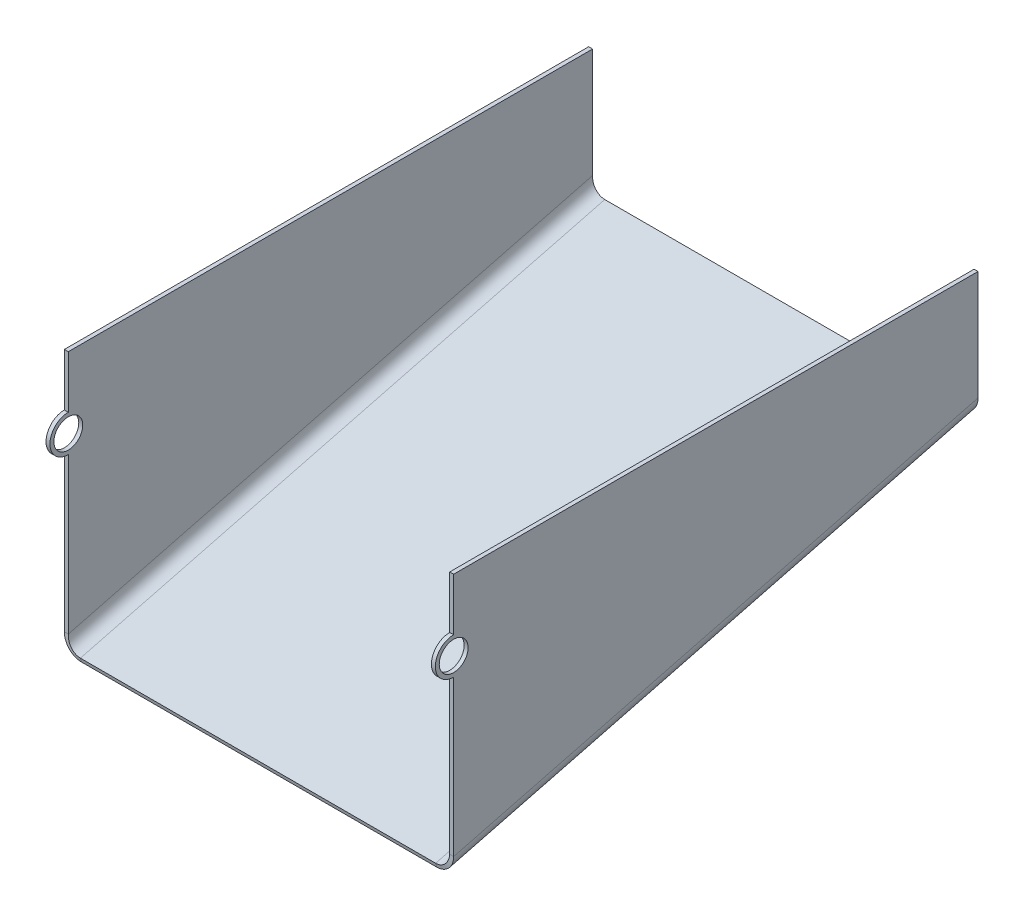
ISO-10303-21;
HEADER;
FILE_DESCRIPTION(('STEP AP214'),'2;1');
FILE_NAME('part.step','',(''),(''),'','','');
FILE_SCHEMA(('AUTOMOTIVE_DESIGN { 1 0 10303 214 1 1 1 1 }'));
ENDSEC;
DATA;
#1=APPLICATION_CONTEXT('core data for automotive mechanical design processes');
#2=APPLICATION_PROTOCOL_DEFINITION('international standard','automotive_design',2000,#1);
#3=PRODUCT_CONTEXT('',#1,'mechanical');
#4=PRODUCT('Part','Part','',(#3));
#5=PRODUCT_RELATED_PRODUCT_CATEGORY('part','',(#4));
#6=PRODUCT_DEFINITION_FORMATION('','',#4);
#7=PRODUCT_DEFINITION_CONTEXT('part definition',#1,'design');
#8=PRODUCT_DEFINITION('design','',#6,#7);
#9=PRODUCT_DEFINITION_SHAPE('','',#8);
#10=(LENGTH_UNIT() NAMED_UNIT(*) SI_UNIT(.MILLI.,.METRE.));
#11=(NAMED_UNIT(*) PLANE_ANGLE_UNIT() SI_UNIT($,.RADIAN.));
#12=(NAMED_UNIT(*) SI_UNIT($,.STERADIAN.) SOLID_ANGLE_UNIT());
#13=UNCERTAINTY_MEASURE_WITH_UNIT(LENGTH_MEASURE(1.E-05),#10,'distance_accuracy_value','');
#14=(GEOMETRIC_REPRESENTATION_CONTEXT(3) GLOBAL_UNCERTAINTY_ASSIGNED_CONTEXT((#13)) GLOBAL_UNIT_ASSIGNED_CONTEXT((#10,
#11,#12)) REPRESENTATION_CONTEXT('',''));
#15=CARTESIAN_POINT('',(0.,0.,0.));
#16=DIRECTION('',(0.,0.,1.));
#17=DIRECTION('',(1.,0.,0.));
#18=AXIS2_PLACEMENT_3D('',#15,#16,#17);
#19=CARTESIAN_POINT('',(297.,51.6415732812399,-366.391066181165));
#20=DIRECTION('',(0.,0.249365435592906,-0.968409458613225));
#21=DIRECTION('',(-1.,0.,0.));
#22=AXIS2_PLACEMENT_3D('',#19,#20,#21);
#23=PLANE('',#22);
#24=DIRECTION('',(0.,-0.968409458613225,-0.249365435592906));
#25=VECTOR('',#24,1.);
#26=CARTESIAN_POINT('',(13.,51.6415732812399,-366.391066181165));
#27=LINE('',#26,#25);
#28=CARTESIAN_POINT('',(13.,54.5468016570796,-365.642969874386));
#29=VERTEX_POINT('',#28);
#30=CARTESIAN_POINT('',(13.,51.6415732812399,-366.391066181165));
#31=VERTEX_POINT('',#30);
#32=EDGE_CURVE('E11',#29,#31,#27,.T.);
#33=ORIENTED_EDGE('',*,*,#32,.F.);
#34=DIRECTION('',(1.,0.,0.));
#35=VECTOR('',#34,1.);
#36=CARTESIAN_POINT('',(297.,54.5468016570796,-365.642969874386));
#37=LINE('',#36,#35);
#38=CARTESIAN_POINT('',(284.,54.5468016570796,-365.642969874386));
#39=VERTEX_POINT('',#38);
#40=EDGE_CURVE('E112',#39,#29,#37,.F.);
#41=ORIENTED_EDGE('',*,*,#40,.F.);
#42=DIRECTION('',(0.,-0.968409458613226,-0.249365435592905));
#43=VECTOR('',#42,1.);
#44=CARTESIAN_POINT('',(284.,51.6415732812399,-366.391066181165));
#45=LINE('',#44,#43);
#46=CARTESIAN_POINT('',(284.,51.6415732812399,-366.391066181165));
#47=VERTEX_POINT('',#46);
#48=EDGE_CURVE('E53',#39,#47,#45,.T.);
#49=ORIENTED_EDGE('',*,*,#48,.T.);
#50=DIRECTION('',(-1.,0.,0.));
#51=VECTOR('',#50,1.);
#52=CARTESIAN_POINT('',(297.,51.6415732812399,-366.391066181165));
#53=LINE('',#52,#51);
#54=EDGE_CURVE('E114',#47,#31,#53,.T.);
#55=ORIENTED_EDGE('',*,*,#54,.T.);
#56=EDGE_LOOP('',(#33,#41,#49,#55));
#57=FACE_BOUND('',#56,.T.);
#58=ADVANCED_FACE('F41',(#57),#23,.T.);
#59=CARTESIAN_POINT('',(284.,54.5468016570796,-365.642969874386));
#60=CARTESIAN_POINT('',(284.,53.5783921984664,-365.892335309979));
#61=CARTESIAN_POINT('',(284.,52.6099827398532,-366.141700745572));
#62=CARTESIAN_POINT('',(284.,51.6415732812399,-366.391066181165));
#63=CARTESIAN_POINT('',(304.,54.5468016570796,-365.642969874386));
#64=CARTESIAN_POINT('',(306.,53.5783921984664,-365.892335309979));
#65=CARTESIAN_POINT('',(308.,52.6099827398532,-366.141700745572));
#66=CARTESIAN_POINT('',(310.,51.6415732812399,-366.391066181165));
#67=CARTESIAN_POINT('',(304.,75.5844924206386,-367.139162487944));
#68=CARTESIAN_POINT('',(306.,76.5529018792519,-366.889797052351));
#69=CARTESIAN_POINT('',(308.,77.5213113378651,-366.640431616758));
#70=CARTESIAN_POINT('',(310.,78.4897207964783,-366.391066181165));
#71=CARTESIAN_POINT('',(284.,75.5844924206386,-367.139162487944));
#72=CARTESIAN_POINT('',(284.,76.5529018792518,-366.889797052351));
#73=CARTESIAN_POINT('',(284.,77.5213113378651,-366.640431616758));
#74=CARTESIAN_POINT('',(284.,78.4897207964783,-366.391066181165));
#75=CARTESIAN_POINT('',(264.,75.5844924206386,-367.139162487944));
#76=CARTESIAN_POINT('',(262.,76.5529018792519,-366.889797052351));
#77=CARTESIAN_POINT('',(260.,77.5213113378651,-366.640431616758));
#78=CARTESIAN_POINT('',(258.,78.4897207964783,-366.391066181165));
#79=CARTESIAN_POINT('',(264.,54.5468016570796,-365.642969874386));
#80=CARTESIAN_POINT('',(262.,53.5783921984664,-365.892335309979));
#81=CARTESIAN_POINT('',(260.,52.6099827398532,-366.141700745572));
#82=CARTESIAN_POINT('',(258.,51.6415732812399,-366.391066181165));
#83=CARTESIAN_POINT('',(284.,54.5468016570796,-365.642969874386));
#84=CARTESIAN_POINT('',(284.,53.5783921984664,-365.892335309979));
#85=CARTESIAN_POINT('',(284.,52.6099827398532,-366.141700745572));
#86=CARTESIAN_POINT('',(284.,51.6415732812399,-366.391066181165));
#87=(BOUNDED_SURFACE() B_SPLINE_SURFACE(3,3,((#59,#60,#61,#62),(#63,#64,#65,#66),(#67,#68,#69,
#70),(#71,#72,#73,#74),(#75,#76,#77,#78),(#79,#80,#81,#82),(#83,#84,#85,#86)),.UNSPECIFIED.,.T.,
.F.,.F.) B_SPLINE_SURFACE_WITH_KNOTS((4,3,4),(4,4),(0.,0.5,1.),(0.,1.),
.UNSPECIFIED.) GEOMETRIC_REPRESENTATION_ITEM() RATIONAL_B_SPLINE_SURFACE(((1.,1.,1.,1.),
(0.333333333333333,0.333333333333333,0.333333333333333,0.333333333333333),(0.333333333333333,
0.333333333333333,0.333333333333333,0.333333333333333),(1.,1.,1.,1.),(0.333333333333333,
0.333333333333333,0.333333333333333,0.333333333333333),(0.333333333333333,0.333333333333333,
0.333333333333333,0.333333333333333),(1.,1.,1.,1.))) REPRESENTATION_ITEM('') SURFACE());
#88=CARTESIAN_POINT('',(284.,65.0656470388591,-366.391066181165));
#89=DIRECTION('',(0.,0.0709404398337377,0.997480553191989));
#90=DIRECTION('',(0.,-0.997480553191989,0.0709404398337377));
#91=AXIS2_PLACEMENT_3D('',#88,#89,#90);
#92=ELLIPSE('',#91,10.5454139913993,10.);
#93=CARTESIAN_POINT('',(294.,65.0656470388591,-366.391066181165));
#94=VERTEX_POINT('',#93);
#95=EDGE_CURVE('E153',#39,#94,#92,.T.);
#96=DIRECTION('',(1.,0.,0.));
#97=VECTOR('',#96,1.);
#98=CARTESIAN_POINT('',(297.,65.0656470388591,-366.391066181165));
#99=LINE('',#98,#97);
#100=CARTESIAN_POINT('',(297.,65.0656470388591,-366.391066181165));
#101=VERTEX_POINT('',#100);
#102=EDGE_CURVE('E192',#94,#101,#99,.T.);
#103=CARTESIAN_POINT('',(284.,65.0656470388591,-366.391066181165));
#104=DIRECTION('',(0.,0.,1.));
#105=DIRECTION('',(0.,-1.,0.));
#106=AXIS2_PLACEMENT_3D('',#103,#104,#105);
#107=ELLIPSE('',#106,13.4240737576192,13.);
#108=EDGE_CURVE('E201',#47,#101,#107,.T.);
#109=ORIENTED_EDGE('',*,*,#48,.F.);
#110=ORIENTED_EDGE('',*,*,#95,.T.);
#111=ORIENTED_EDGE('',*,*,#102,.T.);
#112=ORIENTED_EDGE('',*,*,#108,.F.);
#113=EDGE_LOOP('',(#109,#110,#111,#112));
#114=FACE_BOUND('',#113,.T.);
#115=ADVANCED_FACE('F200',(#114),#87,.T.);
#116=CARTESIAN_POINT('',(297.,51.6415732812399,-366.391066181165));
#117=DIRECTION('',(0.,0.,-1.));
#118=DIRECTION('',(0.,1.,0.));
#119=AXIS2_PLACEMENT_3D('',#116,#117,#118);
#120=PLANE('',#119);
#121=ORIENTED_EDGE('',*,*,#102,.F.);
#122=DIRECTION('',(0.,1.,0.));
#123=VECTOR('',#122,1.);
#124=CARTESIAN_POINT('',(294.,94.64157328124,-366.391066181165));
#125=LINE('',#124,#123);
#126=CARTESIAN_POINT('',(294.,148.64157328124,-366.391066181165));
#127=VERTEX_POINT('',#126);
#128=EDGE_CURVE('E150',#94,#127,#125,.T.);
#129=ORIENTED_EDGE('',*,*,#128,.T.);
#130=DIRECTION('',(1.,0.,0.));
#131=VECTOR('',#130,1.);
#132=CARTESIAN_POINT('',(297.,148.64157328124,-366.391066181165));
#133=LINE('',#132,#131);
#134=CARTESIAN_POINT('',(297.,148.64157328124,-366.391066181165));
#135=VERTEX_POINT('',#134);
#136=EDGE_CURVE('E189',#127,#135,#133,.T.);
#137=ORIENTED_EDGE('',*,*,#136,.T.);
#138=DIRECTION('',(0.,1.,0.));
#139=VECTOR('',#138,1.);
#140=CARTESIAN_POINT('',(297.,51.6415732812399,-366.391066181165));
#141=LINE('',#140,#139);
#142=EDGE_CURVE('E220',#101,#135,#141,.T.);
#143=ORIENTED_EDGE('',*,*,#142,.F.);
#144=EDGE_LOOP('',(#121,#129,#137,#143));
#145=FACE_BOUND('',#144,.T.);
#146=ADVANCED_FACE('F221',(#145),#120,.T.);
#147=CARTESIAN_POINT('',(297.,148.64157328124,33.6089338188351));
#148=DIRECTION('',(0.,-1.,0.));
#149=DIRECTION('',(0.,0.,-1.));
#150=AXIS2_PLACEMENT_3D('',#147,#148,#149);
#151=PLANE('',#150);
#152=ORIENTED_EDGE('',*,*,#136,.F.);
#153=DIRECTION('',(0.,0.,-1.));
#154=VECTOR('',#153,1.);
#155=CARTESIAN_POINT('',(294.,148.64157328124,33.6089338188351));
#156=LINE('',#155,#154);
#157=CARTESIAN_POINT('',(294.,148.64157328124,33.6089338188351));
#158=VERTEX_POINT('',#157);
#159=EDGE_CURVE('E272',#158,#127,#156,.T.);
#160=ORIENTED_EDGE('',*,*,#159,.F.);
#161=DIRECTION('',(1.,0.,0.));
#162=VECTOR('',#161,1.);
#163=CARTESIAN_POINT('',(297.,148.64157328124,33.6089338188351));
#164=LINE('',#163,#162);
#165=CARTESIAN_POINT('',(297.,148.64157328124,33.6089338188351));
#166=VERTEX_POINT('',#165);
#167=EDGE_CURVE('E186',#158,#166,#164,.T.);
#168=ORIENTED_EDGE('',*,*,#167,.T.);
#169=DIRECTION('',(0.,0.,-1.));
#170=VECTOR('',#169,1.);
#171=CARTESIAN_POINT('',(297.,148.64157328124,33.6089338188351));
#172=LINE('',#171,#170);
#173=EDGE_CURVE('E225',#166,#135,#172,.T.);
#174=ORIENTED_EDGE('',*,*,#173,.T.);
#175=EDGE_LOOP('',(#152,#160,#168,#174));
#176=FACE_BOUND('',#175,.T.);
#177=ADVANCED_FACE('F388',(#176),#151,.F.);
#178=CARTESIAN_POINT('',(297.,108.64157328124,33.6089338188351));
#179=DIRECTION('',(0.,0.,-1.));
#180=DIRECTION('',(0.,1.,0.));
#181=AXIS2_PLACEMENT_3D('',#178,#179,#180);
#182=PLANE('',#181);
#183=ORIENTED_EDGE('',*,*,#167,.F.);
#184=DIRECTION('',(0.,1.,0.));
#185=VECTOR('',#184,1.);
#186=CARTESIAN_POINT('',(294.,94.64157328124,33.6089338188351));
#187=LINE('',#186,#185);
#188=CARTESIAN_POINT('',(294.,108.64157328124,33.6089338188351));
#189=VERTEX_POINT('',#188);
#190=EDGE_CURVE('E269',#189,#158,#187,.T.);
#191=ORIENTED_EDGE('',*,*,#190,.F.);
#192=DIRECTION('',(1.,0.,0.));
#193=VECTOR('',#192,1.);
#194=CARTESIAN_POINT('',(297.,108.64157328124,33.6089338188351));
#195=LINE('',#194,#193);
#196=CARTESIAN_POINT('',(297.,108.64157328124,33.6089338188351));
#197=VERTEX_POINT('',#196);
#198=EDGE_CURVE('E183',#189,#197,#195,.T.);
#199=ORIENTED_EDGE('',*,*,#198,.T.);
#200=DIRECTION('',(0.,1.,0.));
#201=VECTOR('',#200,1.);
#202=CARTESIAN_POINT('',(297.,108.64157328124,33.6089338188351));
#203=LINE('',#202,#201);
#204=EDGE_CURVE('E287',#197,#166,#203,.T.);
#205=ORIENTED_EDGE('',*,*,#204,.T.);
#206=EDGE_LOOP('',(#183,#191,#199,#205));
#207=FACE_BOUND('',#206,.T.);
#208=ADVANCED_FACE('F391',(#207),#182,.F.);
#209=CARTESIAN_POINT('',(297.,94.64157328124,33.6089338188351));
#210=DIRECTION('',(1.,0.,0.));
#211=DIRECTION('',(0.,0.,-1.));
#212=AXIS2_PLACEMENT_3D('',#209,#210,#211);
#213=CYLINDRICAL_SURFACE('',#212,14.);
#214=ORIENTED_EDGE('',*,*,#198,.F.);
#215=CARTESIAN_POINT('',(294.,94.64157328124,33.6089338188351));
#216=DIRECTION('',(1.,0.,0.));
#217=DIRECTION('',(0.,0.,-1.));
#218=AXIS2_PLACEMENT_3D('',#215,#216,#217);
#219=CIRCLE('',#218,14.);
#220=CARTESIAN_POINT('',(294.,80.64157328124,33.6089338188351));
#221=VERTEX_POINT('',#220);
#222=EDGE_CURVE('E266',#189,#221,#219,.T.);
#223=ORIENTED_EDGE('',*,*,#222,.T.);
#224=DIRECTION('',(1.,0.,0.));
#225=VECTOR('',#224,1.);
#226=CARTESIAN_POINT('',(297.,80.64157328124,33.6089338188351));
#227=LINE('',#226,#225);
#228=CARTESIAN_POINT('',(297.,80.64157328124,33.6089338188351));
#229=VERTEX_POINT('',#228);
#230=EDGE_CURVE('E180',#221,#229,#227,.T.);
#231=ORIENTED_EDGE('',*,*,#230,.T.);
#232=CARTESIAN_POINT('',(297.,94.64157328124,33.6089338188351));
#233=DIRECTION('',(1.,0.,0.));
#234=DIRECTION('',(0.,0.,-1.));
#235=AXIS2_PLACEMENT_3D('',#232,#233,#234);
#236=CIRCLE('',#235,14.);
#237=EDGE_CURVE('E290',#197,#229,#236,.T.);
#238=ORIENTED_EDGE('',*,*,#237,.F.);
#239=EDGE_LOOP('',(#214,#223,#231,#238));
#240=FACE_BOUND('',#239,.T.);
#241=ADVANCED_FACE('F395',(#240),#213,.T.);
#242=CARTESIAN_POINT('',(297.,-51.3584267187601,33.6089338188351));
#243=DIRECTION('',(0.,0.,-1.));
#244=DIRECTION('',(0.,1.,0.));
#245=AXIS2_PLACEMENT_3D('',#242,#243,#244);
#246=PLANE('',#245);
#247=ORIENTED_EDGE('',*,*,#230,.F.);
#248=DIRECTION('',(0.,1.,0.));
#249=VECTOR('',#248,1.);
#250=CARTESIAN_POINT('',(294.,94.64157328124,33.6089338188351));
#251=LINE('',#250,#249);
#252=CARTESIAN_POINT('',(294.,-37.9343529611409,33.6089338188351));
#253=VERTEX_POINT('',#252);
#254=EDGE_CURVE('E143',#253,#221,#251,.T.);
#255=ORIENTED_EDGE('',*,*,#254,.F.);
#256=DIRECTION('',(1.,0.,0.));
#257=VECTOR('',#256,1.);
#258=CARTESIAN_POINT('',(297.,-37.9343529611409,33.6089338188351));
#259=LINE('',#258,#257);
#260=CARTESIAN_POINT('',(297.,-37.9343529611409,33.6089338188351));
#261=VERTEX_POINT('',#260);
#262=EDGE_CURVE('E177',#253,#261,#259,.T.);
#263=ORIENTED_EDGE('',*,*,#262,.T.);
#264=DIRECTION('',(0.,1.,0.));
#265=VECTOR('',#264,1.);
#266=CARTESIAN_POINT('',(297.,-51.3584267187601,33.6089338188351));
#267=LINE('',#266,#265);
#268=EDGE_CURVE('E232',#261,#229,#267,.T.);
#269=ORIENTED_EDGE('',*,*,#268,.T.);
#270=EDGE_LOOP('',(#247,#255,#263,#269));
#271=FACE_BOUND('',#270,.T.);
#272=ADVANCED_FACE('F345',(#271),#246,.F.);
#273=CARTESIAN_POINT('',(284.,-48.4531983429204,34.3570301256139));
#274=CARTESIAN_POINT('',(284.,-49.4216078015336,34.1076646900209));
#275=CARTESIAN_POINT('',(284.,-50.3900172601469,33.858299254428));
#276=CARTESIAN_POINT('',(284.,-51.3584267187601,33.6089338188351));
#277=CARTESIAN_POINT('',(264.,-48.4531983429204,34.3570301256139));
#278=CARTESIAN_POINT('',(262.,-49.4216078015336,34.107664690021));
#279=CARTESIAN_POINT('',(260.,-50.3900172601469,33.8582992544281));
#280=CARTESIAN_POINT('',(258.,-51.3584267187601,33.6089338188351));
#281=CARTESIAN_POINT('',(264.,-27.4155075793614,32.8608375120564));
#282=CARTESIAN_POINT('',(262.,-26.4470981207482,33.1102029476493));
#283=CARTESIAN_POINT('',(260.,-25.4786886621349,33.3595683832422));
#284=CARTESIAN_POINT('',(258.,-24.5102792035217,33.6089338188351));
#285=CARTESIAN_POINT('',(284.,-27.4155075793614,32.8608375120564));
#286=CARTESIAN_POINT('',(284.,-26.4470981207482,33.1102029476493));
#287=CARTESIAN_POINT('',(284.,-25.4786886621349,33.3595683832422));
#288=CARTESIAN_POINT('',(284.,-24.5102792035217,33.6089338188351));
#289=CARTESIAN_POINT('',(304.,-27.4155075793614,32.8608375120564));
#290=CARTESIAN_POINT('',(306.,-26.4470981207482,33.1102029476493));
#291=CARTESIAN_POINT('',(308.,-25.4786886621349,33.3595683832422));
#292=CARTESIAN_POINT('',(310.,-24.5102792035217,33.6089338188351));
#293=CARTESIAN_POINT('',(304.,-48.4531983429204,34.3570301256139));
#294=CARTESIAN_POINT('',(306.,-49.4216078015336,34.107664690021));
#295=CARTESIAN_POINT('',(308.,-50.3900172601469,33.8582992544281));
#296=CARTESIAN_POINT('',(310.,-51.3584267187601,33.6089338188351));
#297=CARTESIAN_POINT('',(284.,-48.4531983429204,34.3570301256139));
#298=CARTESIAN_POINT('',(284.,-49.4216078015336,34.1076646900209));
#299=CARTESIAN_POINT('',(284.,-50.3900172601469,33.858299254428));
#300=CARTESIAN_POINT('',(284.,-51.3584267187601,33.6089338188351));
#301=(BOUNDED_SURFACE() B_SPLINE_SURFACE(3,3,((#273,#274,#275,#276),(#277,#278,#279,#280),(#281,
#282,#283,#284),(#285,#286,#287,#288),(#289,#290,#291,#292),(#293,#294,#295,#296),(#297,#298,
#299,#300)),.UNSPECIFIED.,.T.,.F.,.F.) B_SPLINE_SURFACE_WITH_KNOTS((4,3,4),(4,4),(0.,0.5,1.),
(0.,1.),.UNSPECIFIED.) GEOMETRIC_REPRESENTATION_ITEM() RATIONAL_B_SPLINE_SURFACE(((1.,1.,1.,1.),
(0.333333333333333,0.333333333333333,0.333333333333333,0.333333333333333),(0.333333333333333,
0.333333333333333,0.333333333333333,0.333333333333333),(1.,1.,1.,1.),(0.333333333333333,
0.333333333333333,0.333333333333333,0.333333333333333),(0.333333333333333,0.333333333333333,
0.333333333333333,0.333333333333333),(1.,1.,1.,1.))) REPRESENTATION_ITEM('') SURFACE());
#302=CARTESIAN_POINT('',(284.,-37.9343529611409,33.6089338188351));
#303=DIRECTION('',(0.,-0.0709404398337377,-0.997480553191989));
#304=DIRECTION('',(0.,-0.997480553191989,0.0709404398337377));
#305=AXIS2_PLACEMENT_3D('',#302,#303,#304);
#306=ELLIPSE('',#305,10.5454139913993,10.);
#307=CARTESIAN_POINT('',(284.,-48.4531983429204,34.3570301256139));
#308=VERTEX_POINT('',#307);
#309=EDGE_CURVE('E148',#253,#308,#306,.T.);
#310=DIRECTION('',(0.,-0.968409458613225,-0.249365435592906));
#311=VECTOR('',#310,1.);
#312=CARTESIAN_POINT('',(284.,-51.3584267187601,33.6089338188351));
#313=LINE('',#312,#311);
#314=CARTESIAN_POINT('',(284.,-51.3584267187601,33.6089338188351));
#315=VERTEX_POINT('',#314);
#316=EDGE_CURVE('E175',#308,#315,#313,.T.);
#317=CARTESIAN_POINT('',(284.,-37.9343529611409,33.6089338188351));
#318=DIRECTION('',(0.,0.,-1.));
#319=DIRECTION('',(0.,-1.,0.));
#320=AXIS2_PLACEMENT_3D('',#317,#318,#319);
#321=ELLIPSE('',#320,13.4240737576192,13.);
#322=EDGE_CURVE('E217',#261,#315,#321,.T.);
#323=ORIENTED_EDGE('',*,*,#262,.F.);
#324=ORIENTED_EDGE('',*,*,#309,.T.);
#325=ORIENTED_EDGE('',*,*,#316,.T.);
#326=ORIENTED_EDGE('',*,*,#322,.F.);
#327=EDGE_LOOP('',(#323,#324,#325,#326));
#328=FACE_BOUND('',#327,.T.);
#329=ADVANCED_FACE('F349',(#328),#301,.T.);
#330=CARTESIAN_POINT('',(297.,-51.3584267187601,33.6089338188351));
#331=DIRECTION('',(0.,0.249365435592906,-0.968409458613225));
#332=DIRECTION('',(-1.,0.,0.));
#333=AXIS2_PLACEMENT_3D('',#330,#331,#332);
#334=PLANE('',#333);
#335=ORIENTED_EDGE('',*,*,#316,.F.);
#336=DIRECTION('',(1.,0.,0.));
#337=VECTOR('',#336,1.);
#338=CARTESIAN_POINT('',(297.,-48.4531983429204,34.3570301256139));
#339=LINE('',#338,#337);
#340=CARTESIAN_POINT('',(13.,-48.4531983429204,34.3570301256139));
#341=VERTEX_POINT('',#340);
#342=EDGE_CURVE('E142',#308,#341,#339,.F.);
#343=ORIENTED_EDGE('',*,*,#342,.T.);
#344=DIRECTION('',(0.,-0.968409458613226,-0.249365435592906));
#345=VECTOR('',#344,1.);
#346=CARTESIAN_POINT('',(13.,-51.3584267187601,33.6089338188351));
#347=LINE('',#346,#345);
#348=CARTESIAN_POINT('',(13.,-51.3584267187601,33.6089338188351));
#349=VERTEX_POINT('',#348);
#350=EDGE_CURVE('E172',#341,#349,#347,.T.);
#351=ORIENTED_EDGE('',*,*,#350,.T.);
#352=DIRECTION('',(-1.,0.,0.));
#353=VECTOR('',#352,1.);
#354=CARTESIAN_POINT('',(297.,-51.3584267187601,33.6089338188351));
#355=LINE('',#354,#353);
#356=EDGE_CURVE('E294',#315,#349,#355,.T.);
#357=ORIENTED_EDGE('',*,*,#356,.F.);
#358=EDGE_LOOP('',(#335,#343,#351,#357));
#359=FACE_BOUND('',#358,.T.);
#360=ADVANCED_FACE('F358',(#359),#334,.F.);
#361=CARTESIAN_POINT('',(13.,-24.5102792035217,33.6089338188351));
#362=CARTESIAN_POINT('',(13.,-25.4786886621349,33.3595683832422));
#363=CARTESIAN_POINT('',(13.,-26.4470981207481,33.1102029476493));
#364=CARTESIAN_POINT('',(13.,-27.4155075793614,32.8608375120564));
#365=CARTESIAN_POINT('',(39.,-24.5102792035217,33.6089338188351));
#366=CARTESIAN_POINT('',(37.,-25.4786886621349,33.3595683832422));
#367=CARTESIAN_POINT('',(35.,-26.4470981207482,33.1102029476493));
#368=CARTESIAN_POINT('',(33.,-27.4155075793614,32.8608375120564));
#369=CARTESIAN_POINT('',(39.,-51.3584267187601,33.6089338188351));
#370=CARTESIAN_POINT('',(37.,-50.3900172601468,33.8582992544281));
#371=CARTESIAN_POINT('',(35.,-49.4216078015336,34.107664690021));
#372=CARTESIAN_POINT('',(33.,-48.4531983429204,34.3570301256139));
#373=CARTESIAN_POINT('',(13.,-51.3584267187601,33.6089338188351));
#374=CARTESIAN_POINT('',(13.,-50.3900172601468,33.858299254428));
#375=CARTESIAN_POINT('',(13.,-49.4216078015336,34.1076646900209));
#376=CARTESIAN_POINT('',(13.,-48.4531983429204,34.3570301256139));
#377=CARTESIAN_POINT('',(-13.,-51.3584267187601,33.6089338188351));
#378=CARTESIAN_POINT('',(-11.,-50.3900172601468,33.8582992544281));
#379=CARTESIAN_POINT('',(-9.,-49.4216078015336,34.107664690021));
#380=CARTESIAN_POINT('',(-6.99999999999999,-48.4531983429204,34.3570301256139));
#381=CARTESIAN_POINT('',(-13.,-24.5102792035217,33.6089338188351));
#382=CARTESIAN_POINT('',(-11.,-25.4786886621349,33.3595683832422));
#383=CARTESIAN_POINT('',(-8.99999999999999,-26.4470981207482,33.1102029476493));
#384=CARTESIAN_POINT('',(-6.99999999999999,-27.4155075793614,32.8608375120564));
#385=CARTESIAN_POINT('',(13.,-24.5102792035217,33.6089338188351));
#386=CARTESIAN_POINT('',(13.,-25.4786886621349,33.3595683832422));
#387=CARTESIAN_POINT('',(13.,-26.4470981207481,33.1102029476493));
#388=CARTESIAN_POINT('',(13.,-27.4155075793614,32.8608375120564));
#389=(BOUNDED_SURFACE() B_SPLINE_SURFACE(3,3,((#361,#362,#363,#364),(#365,#366,#367,#368),(#369,
#370,#371,#372),(#373,#374,#375,#376),(#377,#378,#379,#380),(#381,#382,#383,#384),(#385,#386,
#387,#388)),.UNSPECIFIED.,.T.,.F.,.F.) B_SPLINE_SURFACE_WITH_KNOTS((4,3,4),(4,4),(0.,0.5,1.),
(0.,1.),.UNSPECIFIED.) GEOMETRIC_REPRESENTATION_ITEM() RATIONAL_B_SPLINE_SURFACE(((1.,1.,1.,1.),
(0.333333333333333,0.333333333333333,0.333333333333333,0.333333333333333),(0.333333333333333,
0.333333333333333,0.333333333333333,0.333333333333333),(1.,1.,1.,1.),(0.333333333333333,
0.333333333333333,0.333333333333333,0.333333333333333),(0.333333333333333,0.333333333333333,
0.333333333333333,0.333333333333333),(1.,1.,1.,1.))) REPRESENTATION_ITEM('') SURFACE());
#390=CARTESIAN_POINT('',(13.,-37.9343529611409,33.6089338188351));
#391=DIRECTION('',(0.,0.0709404398337377,0.997480553191989));
#392=DIRECTION('',(0.,0.997480553191989,-0.0709404398337377));
#393=AXIS2_PLACEMENT_3D('',#390,#391,#392);
#394=ELLIPSE('',#393,10.5454139913993,10.);
#395=CARTESIAN_POINT('',(3.00000000000001,-37.9343529611409,33.6089338188351));
#396=VERTEX_POINT('',#395);
#397=EDGE_CURVE('E130',#341,#396,#394,.F.);
#398=DIRECTION('',(-1.,0.,0.));
#399=VECTOR('',#398,1.);
#400=CARTESIAN_POINT('',(0.,-37.9343529611409,33.6089338188351));
#401=LINE('',#400,#399);
#402=CARTESIAN_POINT('',(0.,-37.9343529611409,33.6089338188351));
#403=VERTEX_POINT('',#402);
#404=EDGE_CURVE('E169',#396,#403,#401,.T.);
#405=CARTESIAN_POINT('',(13.,-37.9343529611409,33.6089338188351));
#406=DIRECTION('',(0.,0.,1.));
#407=DIRECTION('',(0.,1.,0.));
#408=AXIS2_PLACEMENT_3D('',#405,#406,#407);
#409=ELLIPSE('',#408,13.4240737576192,13.);
#410=EDGE_CURVE('E226',#349,#403,#409,.F.);
#411=ORIENTED_EDGE('',*,*,#350,.F.);
#412=ORIENTED_EDGE('',*,*,#397,.T.);
#413=ORIENTED_EDGE('',*,*,#404,.T.);
#414=ORIENTED_EDGE('',*,*,#410,.F.);
#415=EDGE_LOOP('',(#411,#412,#413,#414));
#416=FACE_BOUND('',#415,.T.);
#417=ADVANCED_FACE('F413',(#416),#389,.F.);
#418=CARTESIAN_POINT('',(0.,-51.3584267187601,33.6089338188351));
#419=DIRECTION('',(0.,0.,-1.));
#420=DIRECTION('',(0.,1.,0.));
#421=AXIS2_PLACEMENT_3D('',#418,#419,#420);
#422=PLANE('',#421);
#423=ORIENTED_EDGE('',*,*,#404,.F.);
#424=DIRECTION('',(0.,1.,0.));
#425=VECTOR('',#424,1.);
#426=CARTESIAN_POINT('',(3.,94.64157328124,33.6089338188351));
#427=LINE('',#426,#425);
#428=CARTESIAN_POINT('',(3.,80.64157328124,33.6089338188351));
#429=VERTEX_POINT('',#428);
#430=EDGE_CURVE('E260',#396,#429,#427,.T.);
#431=ORIENTED_EDGE('',*,*,#430,.T.);
#432=DIRECTION('',(-1.,0.,0.));
#433=VECTOR('',#432,1.);
#434=CARTESIAN_POINT('',(0.,80.64157328124,33.6089338188351));
#435=LINE('',#434,#433);
#436=CARTESIAN_POINT('',(0.,80.64157328124,33.6089338188351));
#437=VERTEX_POINT('',#436);
#438=EDGE_CURVE('E166',#429,#437,#435,.T.);
#439=ORIENTED_EDGE('',*,*,#438,.T.);
#440=DIRECTION('',(0.,1.,0.));
#441=VECTOR('',#440,1.);
#442=CARTESIAN_POINT('',(0.,-51.3584267187601,33.6089338188351));
#443=LINE('',#442,#441);
#444=EDGE_CURVE('E297',#403,#437,#443,.T.);
#445=ORIENTED_EDGE('',*,*,#444,.F.);
#446=EDGE_LOOP('',(#423,#431,#439,#445));
#447=FACE_BOUND('',#446,.T.);
#448=ADVANCED_FACE('F324',(#447),#422,.F.);
#449=CARTESIAN_POINT('',(0.,94.64157328124,33.6089338188351));
#450=DIRECTION('',(1.,0.,0.));
#451=DIRECTION('',(0.,0.,-1.));
#452=AXIS2_PLACEMENT_3D('',#449,#450,#451);
#453=CYLINDRICAL_SURFACE('',#452,14.);
#454=ORIENTED_EDGE('',*,*,#438,.F.);
#455=CARTESIAN_POINT('',(3.,94.64157328124,33.6089338188351));
#456=DIRECTION('',(1.,0.,0.));
#457=DIRECTION('',(0.,0.,-1.));
#458=AXIS2_PLACEMENT_3D('',#455,#456,#457);
#459=CIRCLE('',#458,14.);
#460=CARTESIAN_POINT('',(3.,108.64157328124,33.6089338188351));
#461=VERTEX_POINT('',#460);
#462=EDGE_CURVE('E257',#461,#429,#459,.T.);
#463=ORIENTED_EDGE('',*,*,#462,.F.);
#464=DIRECTION('',(-1.,0.,0.));
#465=VECTOR('',#464,1.);
#466=CARTESIAN_POINT('',(0.,108.64157328124,33.6089338188351));
#467=LINE('',#466,#465);
#468=CARTESIAN_POINT('',(0.,108.64157328124,33.6089338188351));
#469=VERTEX_POINT('',#468);
#470=EDGE_CURVE('E163',#461,#469,#467,.T.);
#471=ORIENTED_EDGE('',*,*,#470,.T.);
#472=CARTESIAN_POINT('',(0.,94.64157328124,33.6089338188351));
#473=DIRECTION('',(1.,0.,0.));
#474=DIRECTION('',(0.,0.,-1.));
#475=AXIS2_PLACEMENT_3D('',#472,#473,#474);
#476=CIRCLE('',#475,14.);
#477=EDGE_CURVE('E300',#469,#437,#476,.T.);
#478=ORIENTED_EDGE('',*,*,#477,.T.);
#479=EDGE_LOOP('',(#454,#463,#471,#478));
#480=FACE_BOUND('',#479,.T.);
#481=ADVANCED_FACE('F425',(#480),#453,.T.);
#482=CARTESIAN_POINT('',(0.,108.64157328124,33.6089338188351));
#483=DIRECTION('',(0.,0.,-1.));
#484=DIRECTION('',(0.,1.,0.));
#485=AXIS2_PLACEMENT_3D('',#482,#483,#484);
#486=PLANE('',#485);
#487=ORIENTED_EDGE('',*,*,#470,.F.);
#488=DIRECTION('',(0.,1.,0.));
#489=VECTOR('',#488,1.);
#490=CARTESIAN_POINT('',(3.,94.64157328124,33.6089338188351));
#491=LINE('',#490,#489);
#492=CARTESIAN_POINT('',(3.,148.64157328124,33.6089338188351));
#493=VERTEX_POINT('',#492);
#494=EDGE_CURVE('E254',#461,#493,#491,.T.);
#495=ORIENTED_EDGE('',*,*,#494,.T.);
#496=DIRECTION('',(-1.,0.,0.));
#497=VECTOR('',#496,1.);
#498=CARTESIAN_POINT('',(0.,148.64157328124,33.6089338188351));
#499=LINE('',#498,#497);
#500=CARTESIAN_POINT('',(0.,148.64157328124,33.6089338188351));
#501=VERTEX_POINT('',#500);
#502=EDGE_CURVE('E160',#493,#501,#499,.T.);
#503=ORIENTED_EDGE('',*,*,#502,.T.);
#504=DIRECTION('',(0.,1.,0.));
#505=VECTOR('',#504,1.);
#506=CARTESIAN_POINT('',(0.,108.64157328124,33.6089338188351));
#507=LINE('',#506,#505);
#508=EDGE_CURVE('E303',#469,#501,#507,.T.);
#509=ORIENTED_EDGE('',*,*,#508,.F.);
#510=EDGE_LOOP('',(#487,#495,#503,#509));
#511=FACE_BOUND('',#510,.T.);
#512=ADVANCED_FACE('F428',(#511),#486,.F.);
#513=CARTESIAN_POINT('',(0.,148.64157328124,33.6089338188351));
#514=DIRECTION('',(0.,-1.,0.));
#515=DIRECTION('',(0.,0.,-1.));
#516=AXIS2_PLACEMENT_3D('',#513,#514,#515);
#517=PLANE('',#516);
#518=ORIENTED_EDGE('',*,*,#502,.F.);
#519=DIRECTION('',(0.,0.,-1.));
#520=VECTOR('',#519,1.);
#521=CARTESIAN_POINT('',(3.,148.64157328124,33.6089338188351));
#522=LINE('',#521,#520);
#523=CARTESIAN_POINT('',(3.,148.64157328124,-366.391066181165));
#524=VERTEX_POINT('',#523);
#525=EDGE_CURVE('E251',#493,#524,#522,.T.);
#526=ORIENTED_EDGE('',*,*,#525,.T.);
#527=DIRECTION('',(-1.,0.,0.));
#528=VECTOR('',#527,1.);
#529=CARTESIAN_POINT('',(0.,148.64157328124,-366.391066181165));
#530=LINE('',#529,#528);
#531=CARTESIAN_POINT('',(0.,148.64157328124,-366.391066181165));
#532=VERTEX_POINT('',#531);
#533=EDGE_CURVE('E157',#524,#532,#530,.T.);
#534=ORIENTED_EDGE('',*,*,#533,.T.);
#535=DIRECTION('',(0.,0.,-1.));
#536=VECTOR('',#535,1.);
#537=CARTESIAN_POINT('',(0.,148.64157328124,33.6089338188351));
#538=LINE('',#537,#536);
#539=EDGE_CURVE('E306',#501,#532,#538,.T.);
#540=ORIENTED_EDGE('',*,*,#539,.F.);
#541=EDGE_LOOP('',(#518,#526,#534,#540));
#542=FACE_BOUND('',#541,.T.);
#543=ADVANCED_FACE('F432',(#542),#517,.F.);
#544=CARTESIAN_POINT('',(0.,51.6415732812399,-366.391066181165));
#545=DIRECTION('',(0.,0.,-1.));
#546=DIRECTION('',(0.,1.,0.));
#547=AXIS2_PLACEMENT_3D('',#544,#545,#546);
#548=PLANE('',#547);
#549=ORIENTED_EDGE('',*,*,#533,.F.);
#550=DIRECTION('',(0.,1.,0.));
#551=VECTOR('',#550,1.);
#552=CARTESIAN_POINT('',(3.,94.64157328124,-366.391066181165));
#553=LINE('',#552,#551);
#554=CARTESIAN_POINT('',(3.,65.0656470388591,-366.391066181165));
#555=VERTEX_POINT('',#554);
#556=EDGE_CURVE('E135',#555,#524,#553,.T.);
#557=ORIENTED_EDGE('',*,*,#556,.F.);
#558=DIRECTION('',(-1.,0.,0.));
#559=VECTOR('',#558,1.);
#560=CARTESIAN_POINT('',(0.,65.0656470388591,-366.391066181165));
#561=LINE('',#560,#559);
#562=CARTESIAN_POINT('',(0.,65.0656470388591,-366.391066181165));
#563=VERTEX_POINT('',#562);
#564=EDGE_CURVE('E47',#555,#563,#561,.T.);
#565=ORIENTED_EDGE('',*,*,#564,.T.);
#566=DIRECTION('',(0.,1.,0.));
#567=VECTOR('',#566,1.);
#568=CARTESIAN_POINT('',(0.,51.6415732812399,-366.391066181165));
#569=LINE('',#568,#567);
#570=EDGE_CURVE('E309',#563,#532,#569,.T.);
#571=ORIENTED_EDGE('',*,*,#570,.T.);
#572=EDGE_LOOP('',(#549,#557,#565,#571));
#573=FACE_BOUND('',#572,.T.);
#574=ADVANCED_FACE('F334',(#573),#548,.T.);
#575=CARTESIAN_POINT('',(13.,78.4897207964783,-366.391066181165));
#576=CARTESIAN_POINT('',(13.,77.5213113378651,-366.640431616758));
#577=CARTESIAN_POINT('',(13.,76.5529018792519,-366.889797052351));
#578=CARTESIAN_POINT('',(13.,75.5844924206387,-367.139162487944));
#579=CARTESIAN_POINT('',(-13.,78.4897207964783,-366.391066181165));
#580=CARTESIAN_POINT('',(-11.,77.5213113378651,-366.640431616758));
#581=CARTESIAN_POINT('',(-8.99999999999999,76.5529018792519,-366.889797052351));
#582=CARTESIAN_POINT('',(-6.99999999999999,75.5844924206387,-367.139162487944));
#583=CARTESIAN_POINT('',(-13.,51.6415732812399,-366.391066181165));
#584=CARTESIAN_POINT('',(-11.,52.6099827398532,-366.141700745572));
#585=CARTESIAN_POINT('',(-8.99999999999999,53.5783921984664,-365.892335309979));
#586=CARTESIAN_POINT('',(-6.99999999999999,54.5468016570796,-365.642969874386));
#587=CARTESIAN_POINT('',(13.,51.6415732812399,-366.391066181165));
#588=CARTESIAN_POINT('',(13.,52.6099827398532,-366.141700745572));
#589=CARTESIAN_POINT('',(13.,53.5783921984664,-365.892335309979));
#590=CARTESIAN_POINT('',(13.,54.5468016570796,-365.642969874386));
#591=CARTESIAN_POINT('',(39.,51.6415732812399,-366.391066181165));
#592=CARTESIAN_POINT('',(37.,52.6099827398532,-366.141700745572));
#593=CARTESIAN_POINT('',(35.,53.5783921984664,-365.892335309979));
#594=CARTESIAN_POINT('',(33.,54.5468016570796,-365.642969874386));
#595=CARTESIAN_POINT('',(39.,78.4897207964783,-366.391066181165));
#596=CARTESIAN_POINT('',(37.,77.5213113378651,-366.640431616758));
#597=CARTESIAN_POINT('',(35.,76.5529018792519,-366.889797052351));
#598=CARTESIAN_POINT('',(33.,75.5844924206387,-367.139162487944));
#599=CARTESIAN_POINT('',(13.,78.4897207964783,-366.391066181165));
#600=CARTESIAN_POINT('',(13.,77.5213113378651,-366.640431616758));
#601=CARTESIAN_POINT('',(13.,76.5529018792519,-366.889797052351));
#602=CARTESIAN_POINT('',(13.,75.5844924206387,-367.139162487944));
#603=(BOUNDED_SURFACE() B_SPLINE_SURFACE(3,3,((#575,#576,#577,#578),(#579,#580,#581,#582),(#583,
#584,#585,#586),(#587,#588,#589,#590),(#591,#592,#593,#594),(#595,#596,#597,#598),(#599,#600,
#601,#602)),.UNSPECIFIED.,.T.,.F.,.F.) B_SPLINE_SURFACE_WITH_KNOTS((4,3,4),(4,4),(0.,0.5,1.),
(0.,1.),.UNSPECIFIED.) GEOMETRIC_REPRESENTATION_ITEM() RATIONAL_B_SPLINE_SURFACE(((1.,1.,1.,1.),
(0.333333333333333,0.333333333333333,0.333333333333333,0.333333333333333),(0.333333333333333,
0.333333333333333,0.333333333333333,0.333333333333333),(1.,1.,1.,1.),(0.333333333333333,
0.333333333333333,0.333333333333333,0.333333333333333),(0.333333333333333,0.333333333333333,
0.333333333333333,0.333333333333333),(1.,1.,1.,1.))) REPRESENTATION_ITEM('') SURFACE());
#604=CARTESIAN_POINT('',(13.,65.0656470388591,-366.391066181165));
#605=DIRECTION('',(0.,-0.070940439833735,-0.997480553191989));
#606=DIRECTION('',(0.,0.997480553191989,-0.070940439833735));
#607=AXIS2_PLACEMENT_3D('',#604,#605,#606);
#608=ELLIPSE('',#607,10.5454139913993,10.);
#609=EDGE_CURVE('E127',#555,#29,#608,.F.);
#610=CARTESIAN_POINT('',(13.,65.0656470388591,-366.391066181165));
#611=DIRECTION('',(0.,0.,-1.));
#612=DIRECTION('',(0.,1.,0.));
#613=AXIS2_PLACEMENT_3D('',#610,#611,#612);
#614=ELLIPSE('',#613,13.4240737576192,13.);
#615=EDGE_CURVE('E244',#563,#31,#614,.F.);
#616=ORIENTED_EDGE('',*,*,#609,.T.);
#617=ORIENTED_EDGE('',*,*,#32,.T.);
#618=ORIENTED_EDGE('',*,*,#615,.F.);
#619=ORIENTED_EDGE('',*,*,#564,.F.);
#620=EDGE_LOOP('',(#616,#617,#618,#619));
#621=FACE_BOUND('',#620,.T.);
#622=ADVANCED_FACE('F43',(#621),#603,.F.);
#623=CARTESIAN_POINT('',(0.,94.64157328124,33.6089338188351));
#624=DIRECTION('',(1.,0.,0.));
#625=DIRECTION('',(0.,0.,-1.));
#626=AXIS2_PLACEMENT_3D('',#623,#624,#625);
#627=PLANE('',#626);
#628=CARTESIAN_POINT('',(0.,94.64157328124,33.6089338188351));
#629=DIRECTION('',(1.,0.,0.));
#630=DIRECTION('',(0.,0.,-1.));
#631=AXIS2_PLACEMENT_3D('',#628,#629,#630);
#632=CIRCLE('',#631,11.);
#633=CARTESIAN_POINT('',(0.,94.64157328124,22.6089338188351));
#634=VERTEX_POINT('',#633);
#635=EDGE_CURVE('E275',#634,#634,#632,.T.);
#636=ORIENTED_EDGE('',*,*,#635,.T.);
#637=EDGE_LOOP('',(#636));
#638=FACE_BOUND('',#637,.T.);
#639=ORIENTED_EDGE('',*,*,#570,.F.);
#640=DIRECTION('',(0.,0.249365435592906,-0.968409458613225));
#641=VECTOR('',#640,1.);
#642=CARTESIAN_POINT('',(0.,-29.690368168396,1.59345889555389));
#643=LINE('',#642,#641);
#644=EDGE_CURVE('E234',#563,#403,#643,.F.);
#645=ORIENTED_EDGE('',*,*,#644,.T.);
#646=ORIENTED_EDGE('',*,*,#444,.T.);
#647=ORIENTED_EDGE('',*,*,#477,.F.);
#648=ORIENTED_EDGE('',*,*,#508,.T.);
#649=ORIENTED_EDGE('',*,*,#539,.T.);
#650=EDGE_LOOP('',(#639,#645,#646,#647,#648,#649));
#651=FACE_BOUND('',#650,.T.);
#652=ADVANCED_FACE('F329',(#638,#651),#627,.F.);
#653=CARTESIAN_POINT('',(297.,-51.3584267187601,33.6089338188351));
#654=DIRECTION('',(0.,0.968409458613225,0.249365435592906));
#655=DIRECTION('',(0.,-0.249365435592906,0.968409458613225));
#656=AXIS2_PLACEMENT_3D('',#653,#654,#655);
#657=PLANE('',#656);
#658=ORIENTED_EDGE('',*,*,#54,.F.);
#659=DIRECTION('',(0.,0.249365435592906,-0.968409458613225));
#660=VECTOR('',#659,1.);
#661=CARTESIAN_POINT('',(284.,-51.3584267187601,33.6089338188351));
#662=LINE('',#661,#660);
#663=EDGE_CURVE('E216',#47,#315,#662,.F.);
#664=ORIENTED_EDGE('',*,*,#663,.T.);
#665=ORIENTED_EDGE('',*,*,#356,.T.);
#666=DIRECTION('',(0.,0.249365435592906,-0.968409458613225));
#667=VECTOR('',#666,1.);
#668=CARTESIAN_POINT('',(13.,-51.3584267187601,33.6089338188351));
#669=LINE('',#668,#667);
#670=EDGE_CURVE('E238',#349,#31,#669,.T.);
#671=ORIENTED_EDGE('',*,*,#670,.T.);
#672=EDGE_LOOP('',(#658,#664,#665,#671));
#673=FACE_BOUND('',#672,.T.);
#674=ADVANCED_FACE('F361',(#673),#657,.F.);
#675=CARTESIAN_POINT('',(297.,94.64157328124,33.6089338188351));
#676=DIRECTION('',(1.,0.,0.));
#677=DIRECTION('',(0.,0.,-1.));
#678=AXIS2_PLACEMENT_3D('',#675,#676,#677);
#679=PLANE('',#678);
#680=CARTESIAN_POINT('',(297.,94.64157328124,33.6089338188351));
#681=DIRECTION('',(1.,0.,0.));
#682=DIRECTION('',(0.,0.,-1.));
#683=AXIS2_PLACEMENT_3D('',#680,#681,#682);
#684=CIRCLE('',#683,11.);
#685=CARTESIAN_POINT('',(297.,94.64157328124,22.6089338188351));
#686=VERTEX_POINT('',#685);
#687=EDGE_CURVE('E282',#686,#686,#684,.T.);
#688=ORIENTED_EDGE('',*,*,#687,.F.);
#689=EDGE_LOOP('',(#688));
#690=FACE_BOUND('',#689,.T.);
#691=ORIENTED_EDGE('',*,*,#268,.F.);
#692=DIRECTION('',(0.,0.249365435592906,-0.968409458613225));
#693=VECTOR('',#692,1.);
#694=CARTESIAN_POINT('',(297.,64.2308962432119,-363.149315518457));
#695=LINE('',#694,#693);
#696=EDGE_CURVE('E214',#261,#101,#695,.T.);
#697=ORIENTED_EDGE('',*,*,#696,.T.);
#698=ORIENTED_EDGE('',*,*,#142,.T.);
#699=ORIENTED_EDGE('',*,*,#173,.F.);
#700=ORIENTED_EDGE('',*,*,#204,.F.);
#701=ORIENTED_EDGE('',*,*,#237,.T.);
#702=EDGE_LOOP('',(#691,#697,#698,#699,#700,#701));
#703=FACE_BOUND('',#702,.T.);
#704=ADVANCED_FACE('F229',(#690,#703),#679,.T.);
#705=CARTESIAN_POINT('',(13.,-38.7691037567881,36.8506844815429));
#706=DIRECTION('',(0.,0.249365435592906,-0.968409458613225));
#707=DIRECTION('',(0.,0.968409458613225,0.249365435592906));
#708=AXIS2_PLACEMENT_3D('',#705,#706,#707);
#709=CYLINDRICAL_SURFACE('',#708,13.);
#710=ORIENTED_EDGE('',*,*,#410,.T.);
#711=ORIENTED_EDGE('',*,*,#644,.F.);
#712=ORIENTED_EDGE('',*,*,#615,.T.);
#713=ORIENTED_EDGE('',*,*,#670,.F.);
#714=EDGE_LOOP('',(#710,#711,#712,#713));
#715=FACE_BOUND('',#714,.T.);
#716=ADVANCED_FACE('F319',(#715),#709,.T.);
#717=CARTESIAN_POINT('',(284.,-29.690368168396,1.59345889555389));
#718=DIRECTION('',(0.,-0.249365435592906,0.968409458613225));
#719=DIRECTION('',(0.,-0.968409458613225,-0.249365435592906));
#720=AXIS2_PLACEMENT_3D('',#717,#718,#719);
#721=CYLINDRICAL_SURFACE('',#720,13.);
#722=ORIENTED_EDGE('',*,*,#322,.T.);
#723=ORIENTED_EDGE('',*,*,#663,.F.);
#724=ORIENTED_EDGE('',*,*,#108,.T.);
#725=ORIENTED_EDGE('',*,*,#696,.F.);
#726=EDGE_LOOP('',(#722,#723,#724,#725));
#727=FACE_BOUND('',#726,.T.);
#728=ADVANCED_FACE('F212',(#727),#721,.T.);
#729=CARTESIAN_POINT('',(3.,94.64157328124,33.6089338188351));
#730=DIRECTION('',(1.,0.,0.));
#731=DIRECTION('',(0.,0.,-1.));
#732=AXIS2_PLACEMENT_3D('',#729,#730,#731);
#733=PLANE('',#732);
#734=CARTESIAN_POINT('',(3.,94.64157328124,33.6089338188351));
#735=DIRECTION('',(1.,0.,0.));
#736=DIRECTION('',(0.,0.,-1.));
#737=AXIS2_PLACEMENT_3D('',#734,#735,#736);
#738=CIRCLE('',#737,11.);
#739=CARTESIAN_POINT('',(3.,94.64157328124,22.6089338188351));
#740=VERTEX_POINT('',#739);
#741=EDGE_CURVE('E277',#740,#740,#738,.T.);
#742=ORIENTED_EDGE('',*,*,#741,.F.);
#743=EDGE_LOOP('',(#742));
#744=FACE_BOUND('',#743,.T.);
#745=ORIENTED_EDGE('',*,*,#556,.T.);
#746=ORIENTED_EDGE('',*,*,#525,.F.);
#747=ORIENTED_EDGE('',*,*,#494,.F.);
#748=ORIENTED_EDGE('',*,*,#462,.T.);
#749=ORIENTED_EDGE('',*,*,#430,.F.);
#750=DIRECTION('',(0.,0.249365435592906,-0.968409458613225));
#751=VECTOR('',#750,1.);
#752=CARTESIAN_POINT('',(3.00000000000001,-38.7691037567881,36.8506844815429));
#753=LINE('',#752,#751);
#754=EDGE_CURVE('E134',#555,#396,#753,.F.);
#755=ORIENTED_EDGE('',*,*,#754,.F.);
#756=EDGE_LOOP('',(#745,#746,#747,#748,#749,#755));
#757=FACE_BOUND('',#756,.T.);
#758=ADVANCED_FACE('F448',(#744,#757),#733,.T.);
#759=CARTESIAN_POINT('',(297.,-48.4531983429204,34.3570301256139));
#760=DIRECTION('',(0.,0.968409458613225,0.249365435592906));
#761=DIRECTION('',(0.,-0.249365435592906,0.968409458613225));
#762=AXIS2_PLACEMENT_3D('',#759,#760,#761);
#763=PLANE('',#762);
#764=ORIENTED_EDGE('',*,*,#40,.T.);
#765=DIRECTION('',(0.,-0.249365435592906,0.968409458613225));
#766=VECTOR('',#765,1.);
#767=CARTESIAN_POINT('',(13.,-48.4531983429204,34.3570301256139));
#768=LINE('',#767,#766);
#769=EDGE_CURVE('E124',#341,#29,#768,.F.);
#770=ORIENTED_EDGE('',*,*,#769,.F.);
#771=ORIENTED_EDGE('',*,*,#342,.F.);
#772=DIRECTION('',(0.,-0.249365435592906,0.968409458613225));
#773=VECTOR('',#772,1.);
#774=CARTESIAN_POINT('',(284.,-48.4531983429204,34.3570301256139));
#775=LINE('',#774,#773);
#776=EDGE_CURVE('E140',#39,#308,#775,.T.);
#777=ORIENTED_EDGE('',*,*,#776,.F.);
#778=EDGE_LOOP('',(#764,#770,#771,#777));
#779=FACE_BOUND('',#778,.T.);
#780=ADVANCED_FACE('F138',(#779),#763,.T.);
#781=CARTESIAN_POINT('',(294.,94.64157328124,33.6089338188351));
#782=DIRECTION('',(1.,0.,0.));
#783=DIRECTION('',(0.,0.,-1.));
#784=AXIS2_PLACEMENT_3D('',#781,#782,#783);
#785=PLANE('',#784);
#786=CARTESIAN_POINT('',(294.,94.64157328124,33.6089338188351));
#787=DIRECTION('',(-1.,0.,0.));
#788=DIRECTION('',(0.,0.,1.));
#789=AXIS2_PLACEMENT_3D('',#786,#787,#788);
#790=CIRCLE('',#789,11.);
#791=CARTESIAN_POINT('',(294.,94.64157328124,44.6089338188351));
#792=VERTEX_POINT('',#791);
#793=EDGE_CURVE('E722',#792,#792,#790,.T.);
#794=ORIENTED_EDGE('',*,*,#793,.F.);
#795=EDGE_LOOP('',(#794));
#796=FACE_BOUND('',#795,.T.);
#797=ORIENTED_EDGE('',*,*,#254,.T.);
#798=ORIENTED_EDGE('',*,*,#222,.F.);
#799=ORIENTED_EDGE('',*,*,#190,.T.);
#800=ORIENTED_EDGE('',*,*,#159,.T.);
#801=ORIENTED_EDGE('',*,*,#128,.F.);
#802=DIRECTION('',(0.,-0.249365435592906,0.968409458613225));
#803=VECTOR('',#802,1.);
#804=CARTESIAN_POINT('',(294.,-29.690368168396,1.59345889555389));
#805=LINE('',#804,#803);
#806=EDGE_CURVE('E245',#253,#94,#805,.F.);
#807=ORIENTED_EDGE('',*,*,#806,.F.);
#808=EDGE_LOOP('',(#797,#798,#799,#800,#801,#807));
#809=FACE_BOUND('',#808,.T.);
#810=ADVANCED_FACE('F353',(#796,#809),#785,.F.);
#811=CARTESIAN_POINT('',(13.,-38.7691037567881,36.8506844815429));
#812=DIRECTION('',(0.,0.249365435592906,-0.968409458613225));
#813=DIRECTION('',(0.,0.968409458613225,0.249365435592906));
#814=AXIS2_PLACEMENT_3D('',#811,#812,#813);
#815=CYLINDRICAL_SURFACE('',#814,10.);
#816=ORIENTED_EDGE('',*,*,#397,.F.);
#817=ORIENTED_EDGE('',*,*,#769,.T.);
#818=ORIENTED_EDGE('',*,*,#609,.F.);
#819=ORIENTED_EDGE('',*,*,#754,.T.);
#820=EDGE_LOOP('',(#816,#817,#818,#819));
#821=FACE_BOUND('',#820,.T.);
#822=ADVANCED_FACE('F125',(#821),#815,.F.);
#823=CARTESIAN_POINT('',(284.,-29.690368168396,1.59345889555389));
#824=DIRECTION('',(0.,-0.249365435592906,0.968409458613225));
#825=DIRECTION('',(0.,-0.968409458613225,-0.249365435592906));
#826=AXIS2_PLACEMENT_3D('',#823,#824,#825);
#827=CYLINDRICAL_SURFACE('',#826,10.);
#828=ORIENTED_EDGE('',*,*,#309,.F.);
#829=ORIENTED_EDGE('',*,*,#806,.T.);
#830=ORIENTED_EDGE('',*,*,#95,.F.);
#831=ORIENTED_EDGE('',*,*,#776,.T.);
#832=EDGE_LOOP('',(#828,#829,#830,#831));
#833=FACE_BOUND('',#832,.T.);
#834=ADVANCED_FACE('F356',(#833),#827,.F.);
#835=CARTESIAN_POINT('',(-7.,94.64157328124,33.6089338188351));
#836=DIRECTION('',(1.,0.,0.));
#837=DIRECTION('',(0.,0.,-1.));
#838=AXIS2_PLACEMENT_3D('',#835,#836,#837);
#839=CYLINDRICAL_SURFACE('',#838,11.);
#840=ORIENTED_EDGE('',*,*,#741,.T.);
#841=EDGE_LOOP('',(#840));
#842=FACE_BOUND('',#841,.T.);
#843=ORIENTED_EDGE('',*,*,#635,.F.);
#844=EDGE_LOOP('',(#843));
#845=FACE_BOUND('',#844,.T.);
#846=ADVANCED_FACE('F440',(#842,#845),#839,.F.);
#847=CARTESIAN_POINT('',(304.,94.64157328124,33.6089338188351));
#848=DIRECTION('',(-1.,0.,0.));
#849=DIRECTION('',(0.,0.,1.));
#850=AXIS2_PLACEMENT_3D('',#847,#848,#849);
#851=CYLINDRICAL_SURFACE('',#850,11.);
#852=ORIENTED_EDGE('',*,*,#687,.T.);
#853=EDGE_LOOP('',(#852));
#854=FACE_BOUND('',#853,.T.);
#855=ORIENTED_EDGE('',*,*,#793,.T.);
#856=EDGE_LOOP('',(#855));
#857=FACE_BOUND('',#856,.T.);
#858=ADVANCED_FACE('F495',(#854,#857),#851,.F.);
#859=CLOSED_SHELL('',(#58,#115,#146,#177,#208,#241,#272,#329,#360,#417,#448,#481,#512,#543,#574,
#622,#652,#674,#704,#716,#728,#758,#780,#810,#822,#834,#846,#858));
#860=MANIFOLD_SOLID_BREP('B2',#859);
#861=ADVANCED_BREP_SHAPE_REPRESENTATION('',(#18,#860),#14);
#862=SHAPE_DEFINITION_REPRESENTATION(#9,#861);
ENDSEC;
END-ISO-10303-21;
